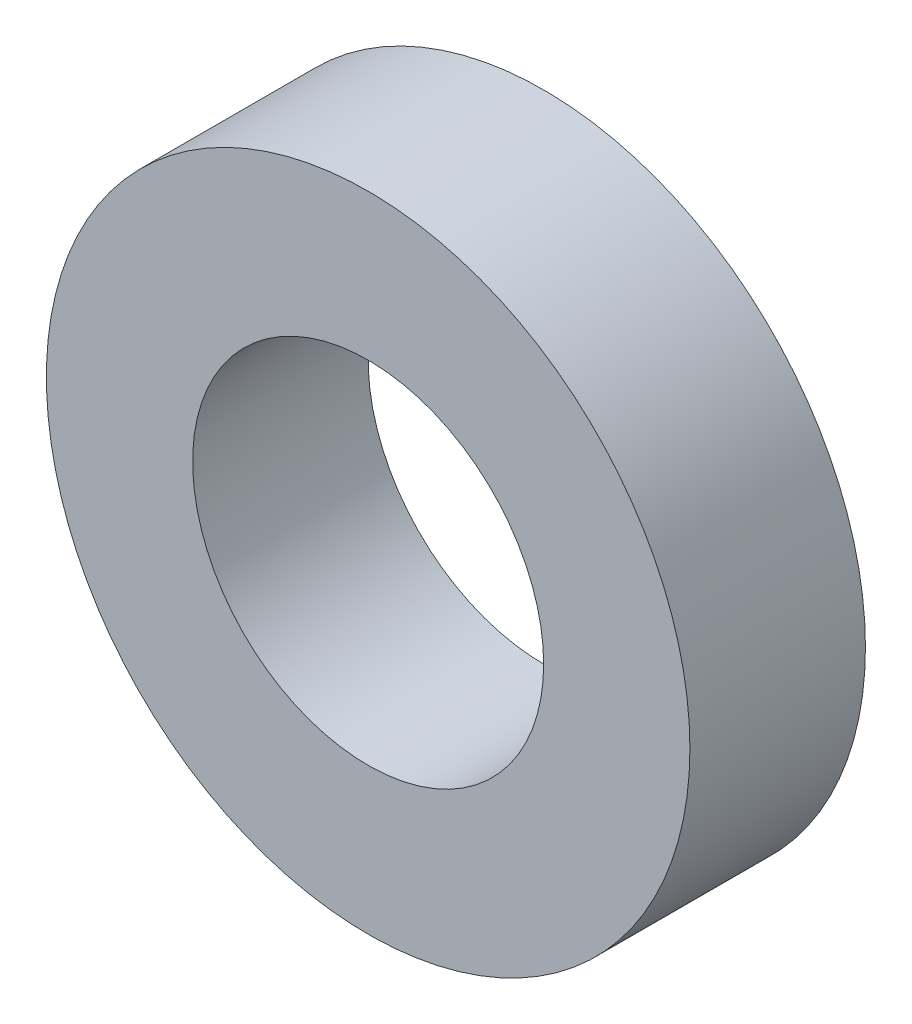
ISO-10303-21;
HEADER;
FILE_DESCRIPTION(('STEP AP214'),'2;1');
FILE_NAME('part.step','',(''),(''),'','','');
FILE_SCHEMA(('AUTOMOTIVE_DESIGN { 1 0 10303 214 1 1 1 1 }'));
ENDSEC;
DATA;
#1=APPLICATION_CONTEXT('core data for automotive mechanical design processes');
#2=APPLICATION_PROTOCOL_DEFINITION('international standard','automotive_design',2000,#1);
#3=PRODUCT_CONTEXT('',#1,'mechanical');
#4=PRODUCT('Part','Part','',(#3));
#5=PRODUCT_RELATED_PRODUCT_CATEGORY('part','',(#4));
#6=PRODUCT_DEFINITION_FORMATION('','',#4);
#7=PRODUCT_DEFINITION_CONTEXT('part definition',#1,'design');
#8=PRODUCT_DEFINITION('design','',#6,#7);
#9=PRODUCT_DEFINITION_SHAPE('','',#8);
#10=(LENGTH_UNIT() NAMED_UNIT(*) SI_UNIT(.MILLI.,.METRE.));
#11=(NAMED_UNIT(*) PLANE_ANGLE_UNIT() SI_UNIT($,.RADIAN.));
#12=(NAMED_UNIT(*) SI_UNIT($,.STERADIAN.) SOLID_ANGLE_UNIT());
#13=UNCERTAINTY_MEASURE_WITH_UNIT(LENGTH_MEASURE(1.E-05),#10,'distance_accuracy_value','');
#14=(GEOMETRIC_REPRESENTATION_CONTEXT(3) GLOBAL_UNCERTAINTY_ASSIGNED_CONTEXT((#13)) GLOBAL_UNIT_ASSIGNED_CONTEXT((#10,
#11,#12)) REPRESENTATION_CONTEXT('',''));
#15=CARTESIAN_POINT('',(0.,0.,0.));
#16=DIRECTION('',(0.,0.,1.));
#17=DIRECTION('',(1.,0.,0.));
#18=AXIS2_PLACEMENT_3D('',#15,#16,#17);
#19=CARTESIAN_POINT('',(11.0077,11.0077,0.007700000000114));
#20=DIRECTION('',(0.,0.,1.));
#21=DIRECTION('',(1.,0.,0.));
#22=AXIS2_PLACEMENT_3D('',#19,#20,#21);
#23=CYLINDRICAL_SURFACE('',#22,6.);
#24=CARTESIAN_POINT('',(11.0077,11.0077,0.007700000000114));
#25=DIRECTION('',(0.,0.,1.));
#26=DIRECTION('',(1.,0.,0.));
#27=AXIS2_PLACEMENT_3D('',#24,#25,#26);
#28=CIRCLE('',#27,6.);
#29=CARTESIAN_POINT('',(17.0077,11.0077,0.007700000000114));
#30=VERTEX_POINT('',#29);
#31=EDGE_CURVE('E25',#30,#30,#28,.F.);
#32=ORIENTED_EDGE('',*,*,#31,.T.);
#33=EDGE_LOOP('',(#32));
#34=FACE_BOUND('',#33,.T.);
#35=CARTESIAN_POINT('',(11.0077,11.0077,6.0077));
#36=DIRECTION('',(0.,0.,1.));
#37=DIRECTION('',(1.,0.,0.));
#38=AXIS2_PLACEMENT_3D('',#35,#36,#37);
#39=CIRCLE('',#38,6.);
#40=CARTESIAN_POINT('',(17.0077,11.0077,6.0077));
#41=VERTEX_POINT('',#40);
#42=EDGE_CURVE('E16',#41,#41,#39,.F.);
#43=ORIENTED_EDGE('',*,*,#42,.F.);
#44=EDGE_LOOP('',(#43));
#45=FACE_BOUND('',#44,.T.);
#46=ADVANCED_FACE('F13',(#34,#45),#23,.F.);
#47=CARTESIAN_POINT('',(11.0077,11.0077,6.0077));
#48=DIRECTION('',(0.,0.,1.));
#49=DIRECTION('',(1.,0.,0.));
#50=AXIS2_PLACEMENT_3D('',#47,#48,#49);
#51=PLANE('',#50);
#52=ORIENTED_EDGE('',*,*,#42,.T.);
#53=EDGE_LOOP('',(#52));
#54=FACE_BOUND('',#53,.T.);
#55=CARTESIAN_POINT('',(11.0077,11.0077,6.0077));
#56=DIRECTION('',(0.,0.,1.));
#57=DIRECTION('',(1.,0.,0.));
#58=AXIS2_PLACEMENT_3D('',#55,#56,#57);
#59=CIRCLE('',#58,11.);
#60=CARTESIAN_POINT('',(22.0077,11.0077,6.0077));
#61=VERTEX_POINT('',#60);
#62=EDGE_CURVE('E20',#61,#61,#59,.F.);
#63=ORIENTED_EDGE('',*,*,#62,.F.);
#64=EDGE_LOOP('',(#63));
#65=FACE_BOUND('',#64,.T.);
#66=ADVANCED_FACE('F33',(#54,#65),#51,.T.);
#67=CARTESIAN_POINT('',(11.0077,11.0077,0.007700000000114));
#68=DIRECTION('',(0.,0.,1.));
#69=DIRECTION('',(1.,0.,0.));
#70=AXIS2_PLACEMENT_3D('',#67,#68,#69);
#71=PLANE('',#70);
#72=ORIENTED_EDGE('',*,*,#31,.F.);
#73=EDGE_LOOP('',(#72));
#74=FACE_BOUND('',#73,.T.);
#75=CARTESIAN_POINT('',(11.0077,11.0077,0.007700000000114));
#76=DIRECTION('',(0.,0.,1.));
#77=DIRECTION('',(1.,0.,0.));
#78=AXIS2_PLACEMENT_3D('',#75,#76,#77);
#79=CIRCLE('',#78,11.);
#80=CARTESIAN_POINT('',(22.0077,11.0077,0.007700000000114));
#81=VERTEX_POINT('',#80);
#82=EDGE_CURVE('E8',#81,#81,#79,.T.);
#83=ORIENTED_EDGE('',*,*,#82,.F.);
#84=EDGE_LOOP('',(#83));
#85=FACE_BOUND('',#84,.T.);
#86=ADVANCED_FACE('F41',(#74,#85),#71,.F.);
#87=CARTESIAN_POINT('',(11.0077,11.0077,0.007700000000114));
#88=DIRECTION('',(0.,0.,1.));
#89=DIRECTION('',(1.,0.,0.));
#90=AXIS2_PLACEMENT_3D('',#87,#88,#89);
#91=CYLINDRICAL_SURFACE('',#90,11.);
#92=ORIENTED_EDGE('',*,*,#82,.T.);
#93=EDGE_LOOP('',(#92));
#94=FACE_BOUND('',#93,.T.);
#95=ORIENTED_EDGE('',*,*,#62,.T.);
#96=EDGE_LOOP('',(#95));
#97=FACE_BOUND('',#96,.T.);
#98=ADVANCED_FACE('F42',(#94,#97),#91,.T.);
#99=CLOSED_SHELL('',(#46,#66,#86,#98));
#100=MANIFOLD_SOLID_BREP('B1',#99);
#101=ADVANCED_BREP_SHAPE_REPRESENTATION('',(#18,#100),#14);
#102=SHAPE_DEFINITION_REPRESENTATION(#9,#101);
ENDSEC;
END-ISO-10303-21;
